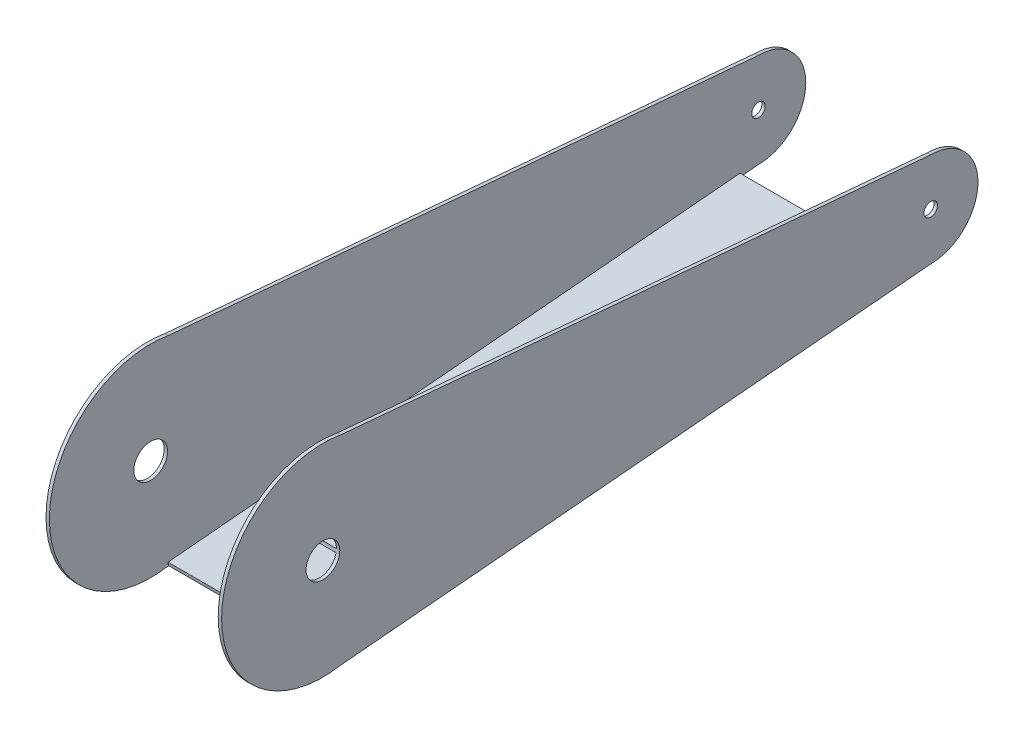
ISO-10303-21;
HEADER;
FILE_DESCRIPTION(('STEP AP214'),'2;1');
FILE_NAME('part.step','',(''),(''),'','','');
FILE_SCHEMA(('AUTOMOTIVE_DESIGN { 1 0 10303 214 1 1 1 1 }'));
ENDSEC;
DATA;
#1=APPLICATION_CONTEXT('core data for automotive mechanical design processes');
#2=APPLICATION_PROTOCOL_DEFINITION('international standard','automotive_design',2000,#1);
#3=PRODUCT_CONTEXT('',#1,'mechanical');
#4=PRODUCT('Part','Part','',(#3));
#5=PRODUCT_RELATED_PRODUCT_CATEGORY('part','',(#4));
#6=PRODUCT_DEFINITION_FORMATION('','',#4);
#7=PRODUCT_DEFINITION_CONTEXT('part definition',#1,'design');
#8=PRODUCT_DEFINITION('design','',#6,#7);
#9=PRODUCT_DEFINITION_SHAPE('','',#8);
#10=(LENGTH_UNIT() NAMED_UNIT(*) SI_UNIT(.MILLI.,.METRE.));
#11=(NAMED_UNIT(*) PLANE_ANGLE_UNIT() SI_UNIT($,.RADIAN.));
#12=(NAMED_UNIT(*) SI_UNIT($,.STERADIAN.) SOLID_ANGLE_UNIT());
#13=UNCERTAINTY_MEASURE_WITH_UNIT(LENGTH_MEASURE(1.E-05),#10,'distance_accuracy_value','');
#14=(GEOMETRIC_REPRESENTATION_CONTEXT(3) GLOBAL_UNCERTAINTY_ASSIGNED_CONTEXT((#13)) GLOBAL_UNIT_ASSIGNED_CONTEXT((#10,
#11,#12)) REPRESENTATION_CONTEXT('',''));
#15=CARTESIAN_POINT('',(0.,0.,0.));
#16=DIRECTION('',(0.,0.,1.));
#17=DIRECTION('',(1.,0.,0.));
#18=AXIS2_PLACEMENT_3D('',#15,#16,#17);
#19=CARTESIAN_POINT('',(25.,0.,-180.));
#20=DIRECTION('',(1.,0.,0.));
#21=DIRECTION('',(0.,0.,-1.));
#22=AXIS2_PLACEMENT_3D('',#19,#20,#21);
#23=PLANE('',#22);
#24=CARTESIAN_POINT('',(25.,0.,-180.));
#25=DIRECTION('',(1.,0.,0.));
#26=DIRECTION('',(0.,0.,-1.));
#27=AXIS2_PLACEMENT_3D('',#24,#25,#26);
#28=CIRCLE('',#27,14.);
#29=CARTESIAN_POINT('',(25.,-14.,-180.));
#30=VERTEX_POINT('',#29);
#31=CARTESIAN_POINT('',(25.,14.,-180.));
#32=VERTEX_POINT('',#31);
#33=EDGE_CURVE('E202',#30,#32,#28,.T.);
#34=ORIENTED_EDGE('',*,*,#33,.F.);
#35=DIRECTION('',(0.,0.0885397902837943,-0.996072640692686));
#36=VECTOR('',#35,1.);
#37=CARTESIAN_POINT('',(25.,-14.,-180.));
#38=LINE('',#37,#36);
#39=CARTESIAN_POINT('',(25.,-14.4804390485647,-174.595060703647));
#40=VERTEX_POINT('',#39);
#41=EDGE_CURVE('E207',#40,#30,#38,.T.);
#42=ORIENTED_EDGE('',*,*,#41,.F.);
#43=DIRECTION('',(0.,-0.996072640692685,-0.0885397902838064));
#44=VECTOR('',#43,1.);
#45=CARTESIAN_POINT('',(25.,-14.4804390485647,-174.595060703647));
#46=LINE('',#45,#44);
#47=CARTESIAN_POINT('',(25.,-13.4843664078711,-174.506520913363));
#48=VERTEX_POINT('',#47);
#49=EDGE_CURVE('E246',#48,#40,#46,.T.);
#50=ORIENTED_EDGE('',*,*,#49,.F.);
#51=DIRECTION('',(0.,0.0885397902838023,-0.996072640692686));
#52=VECTOR('',#51,1.);
#53=CARTESIAN_POINT('',(25.,-13.4843664078711,-174.506520913363));
#54=LINE('',#53,#52);
#55=CARTESIAN_POINT('',(25.,-28.5414398950786,-5.11444418229384));
#56=VERTEX_POINT('',#55);
#57=EDGE_CURVE('E242',#56,#48,#54,.T.);
#58=ORIENTED_EDGE('',*,*,#57,.F.);
#59=DIRECTION('',(0.,0.984321411073003,0.176384125428712));
#60=VECTOR('',#59,1.);
#61=CARTESIAN_POINT('',(25.,-29.5296423321901,-5.29152376286136));
#62=LINE('',#61,#60);
#63=CARTESIAN_POINT('',(25.,-29.5296423321901,-5.29152376286136));
#64=VERTEX_POINT('',#63);
#65=EDGE_CURVE('E238',#64,#56,#62,.T.);
#66=ORIENTED_EDGE('',*,*,#65,.F.);
#67=CARTESIAN_POINT('',(25.,0.,0.));
#68=DIRECTION('',(1.,0.,0.));
#69=DIRECTION('',(0.,0.,-1.));
#70=AXIS2_PLACEMENT_3D('',#67,#68,#69);
#71=CIRCLE('',#70,30.);
#72=CARTESIAN_POINT('',(25.,29.5296423321901,-5.29152376286135));
#73=VERTEX_POINT('',#72);
#74=EDGE_CURVE('E71',#73,#64,#71,.T.);
#75=ORIENTED_EDGE('',*,*,#74,.F.);
#76=DIRECTION('',(0.,0.0885397902837943,0.996072640692686));
#77=VECTOR('',#76,1.);
#78=CARTESIAN_POINT('',(25.,29.5296423321901,-5.29152376286136));
#79=LINE('',#78,#77);
#80=EDGE_CURVE('E233',#32,#73,#79,.T.);
#81=ORIENTED_EDGE('',*,*,#80,.F.);
#82=EDGE_LOOP('',(#34,#42,#50,#58,#66,#75,#81));
#83=FACE_BOUND('',#82,.T.);
#84=DIRECTION('',(0.,0.,1.));
#85=VECTOR('',#84,1.);
#86=CARTESIAN_POINT('',(25.,-1.,0.));
#87=LINE('',#86,#85);
#88=CARTESIAN_POINT('',(25.,-1.,-178.267949192431));
#89=VERTEX_POINT('',#88);
#90=CARTESIAN_POINT('',(25.,-1.,-4.89897948556636));
#91=VERTEX_POINT('',#90);
#92=EDGE_CURVE('E634',#89,#91,#87,.T.);
#93=ORIENTED_EDGE('',*,*,#92,.F.);
#94=CARTESIAN_POINT('',(25.,0.,-180.));
#95=DIRECTION('',(1.,0.,0.));
#96=DIRECTION('',(0.,0.,-1.));
#97=AXIS2_PLACEMENT_3D('',#94,#95,#96);
#98=CIRCLE('',#97,2.);
#99=CARTESIAN_POINT('',(25.,0.,-178.));
#100=VERTEX_POINT('',#99);
#101=EDGE_CURVE('E180',#100,#89,#98,.F.);
#102=ORIENTED_EDGE('',*,*,#101,.F.);
#103=DIRECTION('',(0.,0.,-1.));
#104=VECTOR('',#103,1.);
#105=CARTESIAN_POINT('',(25.,0.,0.));
#106=LINE('',#105,#104);
#107=CARTESIAN_POINT('',(25.,0.,-5.));
#108=VERTEX_POINT('',#107);
#109=EDGE_CURVE('E175',#108,#100,#106,.T.);
#110=ORIENTED_EDGE('',*,*,#109,.F.);
#111=CARTESIAN_POINT('',(25.,0.,0.));
#112=DIRECTION('',(1.,0.,0.));
#113=DIRECTION('',(0.,0.,-1.));
#114=AXIS2_PLACEMENT_3D('',#111,#112,#113);
#115=CIRCLE('',#114,5.);
#116=EDGE_CURVE('E256',#108,#91,#115,.T.);
#117=ORIENTED_EDGE('',*,*,#116,.T.);
#118=EDGE_LOOP('',(#93,#102,#110,#117));
#119=FACE_BOUND('',#118,.T.);
#120=ADVANCED_FACE('F47',(#83,#119),#23,.F.);
#121=CARTESIAN_POINT('',(26.,0.,0.));
#122=DIRECTION('',(-1.,0.,0.));
#123=DIRECTION('',(0.,0.,1.));
#124=AXIS2_PLACEMENT_3D('',#121,#122,#123);
#125=CYLINDRICAL_SURFACE('',#124,30.);
#126=CARTESIAN_POINT('',(-25.,0.,0.));
#127=DIRECTION('',(1.,0.,0.));
#128=DIRECTION('',(0.,0.,-1.));
#129=AXIS2_PLACEMENT_3D('',#126,#127,#128);
#130=CIRCLE('',#129,30.);
#131=CARTESIAN_POINT('',(-25.,29.5296423321901,-5.29152376286136));
#132=VERTEX_POINT('',#131);
#133=CARTESIAN_POINT('',(-25.,-29.5296423321901,-5.29152376286136));
#134=VERTEX_POINT('',#133);
#135=EDGE_CURVE('E210',#132,#134,#130,.T.);
#136=ORIENTED_EDGE('',*,*,#135,.F.);
#137=DIRECTION('',(-1.,0.,0.));
#138=VECTOR('',#137,1.);
#139=CARTESIAN_POINT('',(26.,29.5296423321901,-5.29152376286135));
#140=LINE('',#139,#138);
#141=CARTESIAN_POINT('',(-26.,29.5296423321901,-5.29152376286135));
#142=VERTEX_POINT('',#141);
#143=EDGE_CURVE('E295',#132,#142,#140,.T.);
#144=ORIENTED_EDGE('',*,*,#143,.T.);
#145=CARTESIAN_POINT('',(-26.,0.,0.));
#146=DIRECTION('',(1.,0.,0.));
#147=DIRECTION('',(0.,0.,-1.));
#148=AXIS2_PLACEMENT_3D('',#145,#146,#147);
#149=CIRCLE('',#148,30.);
#150=CARTESIAN_POINT('',(-26.,-29.5296423321901,-5.29152376286135));
#151=VERTEX_POINT('',#150);
#152=EDGE_CURVE('E277',#142,#151,#149,.T.);
#153=ORIENTED_EDGE('',*,*,#152,.T.);
#154=DIRECTION('',(-1.,0.,0.));
#155=VECTOR('',#154,1.);
#156=CARTESIAN_POINT('',(26.,-29.5296423321901,-5.29152376286135));
#157=LINE('',#156,#155);
#158=EDGE_CURVE('E56',#134,#151,#157,.T.);
#159=ORIENTED_EDGE('',*,*,#158,.F.);
#160=EDGE_LOOP('',(#136,#144,#153,#159));
#161=FACE_BOUND('',#160,.T.);
#162=ADVANCED_FACE('F390',(#161),#125,.T.);
#163=CARTESIAN_POINT('',(26.,-14.,-180.));
#164=DIRECTION('',(0.,0.996072640692687,0.0885397902837944));
#165=DIRECTION('',(0.,-0.0885397902837944,0.996072640692687));
#166=AXIS2_PLACEMENT_3D('',#163,#164,#165);
#167=PLANE('',#166);
#168=DIRECTION('',(0.,0.0885397902837943,-0.996072640692686));
#169=VECTOR('',#168,1.);
#170=CARTESIAN_POINT('',(-25.,-14.,-180.));
#171=LINE('',#170,#169);
#172=CARTESIAN_POINT('',(-25.,-14.4804390485647,-174.595060703647));
#173=VERTEX_POINT('',#172);
#174=CARTESIAN_POINT('',(-25.,-14.,-180.));
#175=VERTEX_POINT('',#174);
#176=EDGE_CURVE('E226',#173,#175,#171,.T.);
#177=ORIENTED_EDGE('',*,*,#176,.F.);
#178=DIRECTION('',(1.,0.,0.));
#179=VECTOR('',#178,1.);
#180=CARTESIAN_POINT('',(-25.,-14.4804390485647,-174.595060703647));
#181=LINE('',#180,#179);
#182=EDGE_CURVE('E252',#173,#40,#181,.T.);
#183=ORIENTED_EDGE('',*,*,#182,.T.);
#184=ORIENTED_EDGE('',*,*,#41,.T.);
#185=DIRECTION('',(-1.,0.,0.));
#186=VECTOR('',#185,1.);
#187=CARTESIAN_POINT('',(26.,-14.,-180.));
#188=LINE('',#187,#186);
#189=CARTESIAN_POINT('',(26.,-14.,-180.));
#190=VERTEX_POINT('',#189);
#191=EDGE_CURVE('E319',#190,#30,#188,.T.);
#192=ORIENTED_EDGE('',*,*,#191,.F.);
#193=DIRECTION('',(0.,0.0885397902837943,-0.996072640692686));
#194=VECTOR('',#193,1.);
#195=CARTESIAN_POINT('',(26.,-14.,-180.));
#196=LINE('',#195,#194);
#197=CARTESIAN_POINT('',(26.,-29.5296423321901,-5.29152376286135));
#198=VERTEX_POINT('',#197);
#199=EDGE_CURVE('E285',#198,#190,#196,.T.);
#200=ORIENTED_EDGE('',*,*,#199,.F.);
#201=EDGE_CURVE('E11',#198,#64,#157,.T.);
#202=ORIENTED_EDGE('',*,*,#201,.T.);
#203=DIRECTION('',(1.,0.,0.));
#204=VECTOR('',#203,1.);
#205=CARTESIAN_POINT('',(-25.,-29.5296423321901,-5.29152376286136));
#206=LINE('',#205,#204);
#207=EDGE_CURVE('E229',#134,#64,#206,.T.);
#208=ORIENTED_EDGE('',*,*,#207,.F.);
#209=ORIENTED_EDGE('',*,*,#158,.T.);
#210=DIRECTION('',(0.,0.0885397902837943,-0.996072640692686));
#211=VECTOR('',#210,1.);
#212=CARTESIAN_POINT('',(-26.,-14.,-180.));
#213=LINE('',#212,#211);
#214=CARTESIAN_POINT('',(-26.,-14.,-180.));
#215=VERTEX_POINT('',#214);
#216=EDGE_CURVE('E299',#151,#215,#213,.T.);
#217=ORIENTED_EDGE('',*,*,#216,.T.);
#218=EDGE_CURVE('E318',#175,#215,#188,.T.);
#219=ORIENTED_EDGE('',*,*,#218,.F.);
#220=EDGE_LOOP('',(#177,#183,#184,#192,#200,#202,#208,#209,#217,#219));
#221=FACE_BOUND('',#220,.T.);
#222=ADVANCED_FACE('F339',(#221),#167,.F.);
#223=CARTESIAN_POINT('',(26.,0.,-180.));
#224=DIRECTION('',(-1.,0.,0.));
#225=DIRECTION('',(0.,0.,1.));
#226=AXIS2_PLACEMENT_3D('',#223,#224,#225);
#227=CYLINDRICAL_SURFACE('',#226,14.);
#228=CARTESIAN_POINT('',(-25.,0.,-180.));
#229=DIRECTION('',(1.,0.,0.));
#230=DIRECTION('',(0.,0.,-1.));
#231=AXIS2_PLACEMENT_3D('',#228,#229,#230);
#232=CIRCLE('',#231,14.);
#233=CARTESIAN_POINT('',(-25.,14.,-180.));
#234=VERTEX_POINT('',#233);
#235=EDGE_CURVE('E203',#175,#234,#232,.T.);
#236=ORIENTED_EDGE('',*,*,#235,.F.);
#237=ORIENTED_EDGE('',*,*,#218,.T.);
#238=CARTESIAN_POINT('',(-26.,0.,-180.));
#239=DIRECTION('',(1.,0.,0.));
#240=DIRECTION('',(0.,0.,-1.));
#241=AXIS2_PLACEMENT_3D('',#238,#239,#240);
#242=CIRCLE('',#241,14.);
#243=CARTESIAN_POINT('',(-26.,14.,-180.));
#244=VERTEX_POINT('',#243);
#245=EDGE_CURVE('E303',#215,#244,#242,.T.);
#246=ORIENTED_EDGE('',*,*,#245,.T.);
#247=DIRECTION('',(-1.,0.,0.));
#248=VECTOR('',#247,1.);
#249=CARTESIAN_POINT('',(26.,14.,-180.));
#250=LINE('',#249,#248);
#251=EDGE_CURVE('E314',#234,#244,#250,.T.);
#252=ORIENTED_EDGE('',*,*,#251,.F.);
#253=EDGE_LOOP('',(#236,#237,#246,#252));
#254=FACE_BOUND('',#253,.T.);
#255=ADVANCED_FACE('F332',(#254),#227,.T.);
#256=CARTESIAN_POINT('',(26.,29.5296423321901,-5.29152376286135));
#257=DIRECTION('',(0.,-0.996072640692687,0.0885397902837944));
#258=DIRECTION('',(0.,-0.0885397902837944,-0.996072640692687));
#259=AXIS2_PLACEMENT_3D('',#256,#257,#258);
#260=PLANE('',#259);
#261=DIRECTION('',(0.,0.0885397902837943,0.996072640692686));
#262=VECTOR('',#261,1.);
#263=CARTESIAN_POINT('',(-25.,29.5296423321901,-5.29152376286136));
#264=LINE('',#263,#262);
#265=EDGE_CURVE('E206',#234,#132,#264,.T.);
#266=ORIENTED_EDGE('',*,*,#265,.F.);
#267=ORIENTED_EDGE('',*,*,#251,.T.);
#268=DIRECTION('',(0.,0.0885397902837943,0.996072640692686));
#269=VECTOR('',#268,1.);
#270=CARTESIAN_POINT('',(-26.,29.5296423321901,-5.29152376286135));
#271=LINE('',#270,#269);
#272=EDGE_CURVE('E286',#244,#142,#271,.T.);
#273=ORIENTED_EDGE('',*,*,#272,.T.);
#274=ORIENTED_EDGE('',*,*,#143,.F.);
#275=EDGE_LOOP('',(#266,#267,#273,#274));
#276=FACE_BOUND('',#275,.T.);
#277=ADVANCED_FACE('F349',(#276),#260,.F.);
#278=CARTESIAN_POINT('',(26.,0.,0.));
#279=DIRECTION('',(-1.,0.,0.));
#280=DIRECTION('',(0.,0.,1.));
#281=AXIS2_PLACEMENT_3D('',#278,#279,#280);
#282=CYLINDRICAL_SURFACE('',#281,5.);
#283=CARTESIAN_POINT('',(-26.,0.,0.));
#284=DIRECTION('',(1.,0.,0.));
#285=DIRECTION('',(0.,0.,-1.));
#286=AXIS2_PLACEMENT_3D('',#283,#284,#285);
#287=CIRCLE('',#286,5.);
#288=CARTESIAN_POINT('',(-26.,0.,5.));
#289=VERTEX_POINT('',#288);
#290=EDGE_CURVE('E272',#289,#289,#287,.T.);
#291=CARTESIAN_POINT('',(-25.,0.,0.));
#292=DIRECTION('',(1.,0.,0.));
#293=DIRECTION('',(0.,0.,-1.));
#294=AXIS2_PLACEMENT_3D('',#291,#292,#293);
#295=CIRCLE('',#294,5.);
#296=CARTESIAN_POINT('',(-25.,0.,5.));
#297=VERTEX_POINT('',#296);
#298=EDGE_CURVE('E268',#297,#297,#295,.T.);
#299=CARTESIAN_POINT('',(-26.,0.,5.));
#300=CARTESIAN_POINT('',(-25.9895833333333,0.,5.));
#301=CARTESIAN_POINT('',(-25.9791666666667,0.,5.));
#302=CARTESIAN_POINT('',(-25.9583333333333,0.,5.));
#303=CARTESIAN_POINT('',(-25.9479166666667,0.,5.));
#304=CARTESIAN_POINT('',(-25.9270833333333,0.,5.));
#305=CARTESIAN_POINT('',(-25.9166666666667,0.,5.));
#306=CARTESIAN_POINT('',(-25.8958333333333,0.,5.));
#307=CARTESIAN_POINT('',(-25.8854166666667,0.,5.));
#308=CARTESIAN_POINT('',(-25.8645833333333,0.,5.));
#309=CARTESIAN_POINT('',(-25.8541666666667,0.,5.));
#310=CARTESIAN_POINT('',(-25.8333333333333,0.,5.));
#311=CARTESIAN_POINT('',(-25.8229166666667,0.,5.));
#312=CARTESIAN_POINT('',(-25.8020833333333,0.,5.));
#313=CARTESIAN_POINT('',(-25.7916666666667,0.,5.));
#314=CARTESIAN_POINT('',(-25.7708333333333,0.,5.));
#315=CARTESIAN_POINT('',(-25.7604166666667,0.,5.));
#316=CARTESIAN_POINT('',(-25.7395833333333,0.,5.));
#317=CARTESIAN_POINT('',(-25.7291666666667,0.,5.));
#318=CARTESIAN_POINT('',(-25.7083333333333,0.,5.));
#319=CARTESIAN_POINT('',(-25.6979166666667,0.,5.));
#320=CARTESIAN_POINT('',(-25.6770833333333,0.,5.));
#321=CARTESIAN_POINT('',(-25.6666666666667,0.,5.));
#322=CARTESIAN_POINT('',(-25.6458333333333,0.,5.));
#323=CARTESIAN_POINT('',(-25.6354166666667,0.,5.));
#324=CARTESIAN_POINT('',(-25.6145833333333,0.,5.));
#325=CARTESIAN_POINT('',(-25.6041666666667,0.,5.));
#326=CARTESIAN_POINT('',(-25.5833333333333,0.,5.));
#327=CARTESIAN_POINT('',(-25.5729166666667,0.,5.));
#328=CARTESIAN_POINT('',(-25.5520833333333,0.,5.));
#329=CARTESIAN_POINT('',(-25.5416666666667,0.,5.));
#330=CARTESIAN_POINT('',(-25.5208333333333,0.,5.));
#331=CARTESIAN_POINT('',(-25.5104166666667,0.,5.));
#332=CARTESIAN_POINT('',(-25.4895833333333,0.,5.));
#333=CARTESIAN_POINT('',(-25.4791666666667,0.,5.));
#334=CARTESIAN_POINT('',(-25.4583333333333,0.,5.));
#335=CARTESIAN_POINT('',(-25.4479166666667,0.,5.));
#336=CARTESIAN_POINT('',(-25.4270833333333,0.,5.));
#337=CARTESIAN_POINT('',(-25.4166666666667,0.,5.));
#338=CARTESIAN_POINT('',(-25.3958333333333,0.,5.));
#339=CARTESIAN_POINT('',(-25.3854166666667,0.,5.));
#340=CARTESIAN_POINT('',(-25.3645833333333,0.,5.));
#341=CARTESIAN_POINT('',(-25.3541666666667,0.,5.));
#342=CARTESIAN_POINT('',(-25.3333333333333,0.,5.));
#343=CARTESIAN_POINT('',(-25.3229166666667,0.,5.));
#344=CARTESIAN_POINT('',(-25.3020833333333,0.,5.));
#345=CARTESIAN_POINT('',(-25.2916666666667,0.,5.));
#346=CARTESIAN_POINT('',(-25.2708333333333,0.,5.));
#347=CARTESIAN_POINT('',(-25.2604166666667,0.,5.));
#348=CARTESIAN_POINT('',(-25.2395833333333,0.,5.));
#349=CARTESIAN_POINT('',(-25.2291666666667,0.,5.));
#350=CARTESIAN_POINT('',(-25.2083333333333,0.,5.));
#351=CARTESIAN_POINT('',(-25.1979166666667,0.,5.));
#352=CARTESIAN_POINT('',(-25.1770833333333,0.,5.));
#353=CARTESIAN_POINT('',(-25.1666666666667,0.,5.));
#354=CARTESIAN_POINT('',(-25.1458333333333,0.,5.));
#355=CARTESIAN_POINT('',(-25.1354166666667,0.,5.));
#356=CARTESIAN_POINT('',(-25.1145833333333,0.,5.));
#357=CARTESIAN_POINT('',(-25.1041666666667,0.,5.));
#358=CARTESIAN_POINT('',(-25.0833333333333,0.,5.));
#359=CARTESIAN_POINT('',(-25.0729166666667,0.,5.));
#360=CARTESIAN_POINT('',(-25.0520833333333,0.,5.));
#361=CARTESIAN_POINT('',(-25.0416666666667,0.,5.));
#362=CARTESIAN_POINT('',(-25.0208333333333,0.,5.));
#363=CARTESIAN_POINT('',(-25.0104166666667,0.,5.));
#364=CARTESIAN_POINT('',(-25.,0.,5.));
#365=B_SPLINE_CURVE_WITH_KNOTS('',3,(#299,#300,#301,#302,#303,#304,#305,#306,#307,#308,#309,
#310,#311,#312,#313,#314,#315,#316,#317,#318,#319,#320,#321,#322,#323,#324,#325,#326,#327,#328,
#329,#330,#331,#332,#333,#334,#335,#336,#337,#338,#339,#340,#341,#342,#343,#344,#345,#346,#347,
#348,#349,#350,#351,#352,#353,#354,#355,#356,#357,#358,#359,#360,#361,#362,#363,#364),
.UNSPECIFIED.,.F.,.F.,(4,2,2,2,2,2,2,2,2,2,2,2,2,2,2,2,2,2,2,2,2,2,2,2,2,2,2,2,2,2,2,2,4),(0.,
0.0312499999999966,0.0625000000000001,0.0937499999999966,0.125,0.156249999999997,0.1875,
0.218749999999997,0.25,0.281249999999997,0.312499999999993,0.343749999999997,0.374999999999993,
0.406249999999997,0.437499999999993,0.468749999999997,0.499999999999994,0.53124999999999,
0.562499999999994,0.59374999999999,0.624999999999994,0.65624999999999,0.687499999999994,
0.71874999999999,0.749999999999987,0.78124999999999,0.812499999999987,0.84374999999999,
0.874999999999987,0.90624999999999,0.937499999999987,0.96874999999999,0.999999999999987),.UNSPECIFIED.);
#366=EDGE_CURVE('BSEAM445',#289,#297,#365,.T.);
#367=ORIENTED_EDGE('',*,*,#290,.F.);
#368=ORIENTED_EDGE('',*,*,#298,.T.);
#369=ORIENTED_EDGE('',*,*,#366,.T.);
#370=ORIENTED_EDGE('',*,*,#366,.F.);
#371=EDGE_LOOP('',(#367,#369,#368,#370));
#372=FACE_BOUND('',#371,.T.);
#373=ADVANCED_FACE('F445',(#372),#282,.F.);
#374=CARTESIAN_POINT('',(26.,0.,0.));
#375=DIRECTION('',(1.,0.,0.));
#376=DIRECTION('',(0.,0.,-1.));
#377=AXIS2_PLACEMENT_3D('',#374,#375,#376);
#378=PLANE('',#377);
#379=CARTESIAN_POINT('',(26.,0.,0.));
#380=DIRECTION('',(1.,0.,0.));
#381=DIRECTION('',(0.,0.,-1.));
#382=AXIS2_PLACEMENT_3D('',#379,#380,#381);
#383=CIRCLE('',#382,5.);
#384=CARTESIAN_POINT('',(26.,0.,-5.));
#385=VERTEX_POINT('',#384);
#386=EDGE_CURVE('E273',#385,#385,#383,.T.);
#387=ORIENTED_EDGE('',*,*,#386,.F.);
#388=EDGE_LOOP('',(#387));
#389=FACE_BOUND('',#388,.T.);
#390=CARTESIAN_POINT('',(26.,0.,0.));
#391=DIRECTION('',(1.,0.,0.));
#392=DIRECTION('',(0.,0.,-1.));
#393=AXIS2_PLACEMENT_3D('',#390,#391,#392);
#394=CIRCLE('',#393,30.);
#395=CARTESIAN_POINT('',(26.,29.5296423321901,-5.29152376286135));
#396=VERTEX_POINT('',#395);
#397=EDGE_CURVE('E281',#396,#198,#394,.T.);
#398=ORIENTED_EDGE('',*,*,#397,.T.);
#399=ORIENTED_EDGE('',*,*,#199,.T.);
#400=CARTESIAN_POINT('',(26.,0.,-180.));
#401=DIRECTION('',(1.,0.,0.));
#402=DIRECTION('',(0.,0.,-1.));
#403=AXIS2_PLACEMENT_3D('',#400,#401,#402);
#404=CIRCLE('',#403,14.);
#405=CARTESIAN_POINT('',(26.,14.,-180.));
#406=VERTEX_POINT('',#405);
#407=EDGE_CURVE('E289',#190,#406,#404,.T.);
#408=ORIENTED_EDGE('',*,*,#407,.T.);
#409=DIRECTION('',(0.,0.0885397902837943,0.996072640692686));
#410=VECTOR('',#409,1.);
#411=CARTESIAN_POINT('',(26.,29.5296423321901,-5.29152376286135));
#412=LINE('',#411,#410);
#413=EDGE_CURVE('E292',#406,#396,#412,.T.);
#414=ORIENTED_EDGE('',*,*,#413,.T.);
#415=EDGE_LOOP('',(#398,#399,#408,#414));
#416=FACE_BOUND('',#415,.T.);
#417=CARTESIAN_POINT('',(26.,0.,-180.));
#418=DIRECTION('',(1.,0.,0.));
#419=DIRECTION('',(0.,0.,-1.));
#420=AXIS2_PLACEMENT_3D('',#417,#418,#419);
#421=CIRCLE('',#420,2.);
#422=CARTESIAN_POINT('',(26.,0.,-182.));
#423=VERTEX_POINT('',#422);
#424=EDGE_CURVE('E182',#423,#423,#421,.T.);
#425=ORIENTED_EDGE('',*,*,#424,.F.);
#426=EDGE_LOOP('',(#425));
#427=FACE_BOUND('',#426,.T.);
#428=ADVANCED_FACE('F409',(#389,#416,#427),#378,.T.);
#429=CARTESIAN_POINT('',(-26.,0.,0.));
#430=DIRECTION('',(1.,0.,0.));
#431=DIRECTION('',(0.,0.,-1.));
#432=AXIS2_PLACEMENT_3D('',#429,#430,#431);
#433=PLANE('',#432);
#434=ORIENTED_EDGE('',*,*,#152,.F.);
#435=ORIENTED_EDGE('',*,*,#272,.F.);
#436=ORIENTED_EDGE('',*,*,#245,.F.);
#437=ORIENTED_EDGE('',*,*,#216,.F.);
#438=EDGE_LOOP('',(#434,#435,#436,#437));
#439=FACE_BOUND('',#438,.T.);
#440=ORIENTED_EDGE('',*,*,#290,.T.);
#441=EDGE_LOOP('',(#440));
#442=FACE_BOUND('',#441,.T.);
#443=CARTESIAN_POINT('',(-26.,0.,-180.));
#444=DIRECTION('',(-1.,0.,0.));
#445=DIRECTION('',(0.,0.,1.));
#446=AXIS2_PLACEMENT_3D('',#443,#444,#445);
#447=CIRCLE('',#446,2.);
#448=CARTESIAN_POINT('',(-26.,0.,-178.));
#449=VERTEX_POINT('',#448);
#450=EDGE_CURVE('E194',#449,#449,#447,.T.);
#451=ORIENTED_EDGE('',*,*,#450,.F.);
#452=EDGE_LOOP('',(#451));
#453=FACE_BOUND('',#452,.T.);
#454=ADVANCED_FACE('F344',(#439,#442,#453),#433,.F.);
#455=EDGE_CURVE('E310',#396,#73,#140,.T.);
#456=ORIENTED_EDGE('',*,*,#455,.T.);
#457=ORIENTED_EDGE('',*,*,#74,.T.);
#458=ORIENTED_EDGE('',*,*,#201,.F.);
#459=ORIENTED_EDGE('',*,*,#397,.F.);
#460=EDGE_LOOP('',(#456,#457,#458,#459));
#461=FACE_BOUND('',#460,.T.);
#462=ADVANCED_FACE('F49',(#461),#125,.T.);
#463=ORIENTED_EDGE('',*,*,#191,.T.);
#464=ORIENTED_EDGE('',*,*,#33,.T.);
#465=EDGE_CURVE('E315',#406,#32,#250,.T.);
#466=ORIENTED_EDGE('',*,*,#465,.F.);
#467=ORIENTED_EDGE('',*,*,#407,.F.);
#468=EDGE_LOOP('',(#463,#464,#466,#467));
#469=FACE_BOUND('',#468,.T.);
#470=ADVANCED_FACE('F402',(#469),#227,.T.);
#471=ORIENTED_EDGE('',*,*,#465,.T.);
#472=ORIENTED_EDGE('',*,*,#80,.T.);
#473=ORIENTED_EDGE('',*,*,#455,.F.);
#474=ORIENTED_EDGE('',*,*,#413,.F.);
#475=EDGE_LOOP('',(#471,#472,#473,#474));
#476=FACE_BOUND('',#475,.T.);
#477=ADVANCED_FACE('F405',(#476),#260,.F.);
#478=ORIENTED_EDGE('',*,*,#116,.F.);
#479=DIRECTION('',(1.,0.,0.));
#480=VECTOR('',#479,1.);
#481=CARTESIAN_POINT('',(20.,0.,-5.));
#482=LINE('',#481,#480);
#483=CARTESIAN_POINT('',(20.,0.,-5.));
#484=VERTEX_POINT('',#483);
#485=EDGE_CURVE('E188',#484,#108,#482,.T.);
#486=ORIENTED_EDGE('',*,*,#485,.F.);
#487=CARTESIAN_POINT('',(20.,0.,0.));
#488=DIRECTION('',(-1.,0.,0.));
#489=DIRECTION('',(0.,0.,1.));
#490=AXIS2_PLACEMENT_3D('',#487,#488,#489);
#491=CIRCLE('',#490,5.);
#492=CARTESIAN_POINT('',(20.,-1.,-4.89897948556636));
#493=VERTEX_POINT('',#492);
#494=EDGE_CURVE('E168',#493,#484,#491,.F.);
#495=ORIENTED_EDGE('',*,*,#494,.F.);
#496=DIRECTION('',(1.,0.,0.));
#497=VECTOR('',#496,1.);
#498=CARTESIAN_POINT('',(20.,-1.,-4.89897948556636));
#499=LINE('',#498,#497);
#500=EDGE_CURVE('E164',#493,#91,#499,.T.);
#501=ORIENTED_EDGE('',*,*,#500,.T.);
#502=EDGE_LOOP('',(#478,#486,#495,#501));
#503=FACE_BOUND('',#502,.T.);
#504=ORIENTED_EDGE('',*,*,#386,.T.);
#505=EDGE_LOOP('',(#504));
#506=FACE_BOUND('',#505,.T.);
#507=ADVANCED_FACE('F434',(#503,#506),#282,.F.);
#508=CARTESIAN_POINT('',(-25.,-14.4804390485647,-174.595060703647));
#509=DIRECTION('',(0.,-0.0885397902838064,0.996072640692686));
#510=DIRECTION('',(0.,-0.996072640692686,-0.0885397902838064));
#511=AXIS2_PLACEMENT_3D('',#508,#509,#510);
#512=PLANE('',#511);
#513=ORIENTED_EDGE('',*,*,#49,.T.);
#514=ORIENTED_EDGE('',*,*,#182,.F.);
#515=DIRECTION('',(0.,-0.996072640692685,-0.0885397902838064));
#516=VECTOR('',#515,1.);
#517=CARTESIAN_POINT('',(-25.,-14.4804390485647,-174.595060703647));
#518=LINE('',#517,#516);
#519=CARTESIAN_POINT('',(-25.,-13.4843664078711,-174.506520913363));
#520=VERTEX_POINT('',#519);
#521=EDGE_CURVE('E222',#520,#173,#518,.T.);
#522=ORIENTED_EDGE('',*,*,#521,.F.);
#523=DIRECTION('',(1.,0.,0.));
#524=VECTOR('',#523,1.);
#525=CARTESIAN_POINT('',(-25.,-13.4843664078711,-174.506520913363));
#526=LINE('',#525,#524);
#527=EDGE_CURVE('E257',#520,#48,#526,.T.);
#528=ORIENTED_EDGE('',*,*,#527,.T.);
#529=EDGE_LOOP('',(#513,#514,#522,#528));
#530=FACE_BOUND('',#529,.T.);
#531=ADVANCED_FACE('F397',(#530),#512,.F.);
#532=CARTESIAN_POINT('',(-25.,-13.4843664078711,-174.506520913363));
#533=DIRECTION('',(0.,-0.996072640692686,-0.0885397902838023));
#534=DIRECTION('',(0.,0.0885397902838023,-0.996072640692686));
#535=AXIS2_PLACEMENT_3D('',#532,#533,#534);
#536=PLANE('',#535);
#537=ORIENTED_EDGE('',*,*,#57,.T.);
#538=ORIENTED_EDGE('',*,*,#527,.F.);
#539=DIRECTION('',(0.,0.0885397902838023,-0.996072640692686));
#540=VECTOR('',#539,1.);
#541=CARTESIAN_POINT('',(-25.,-13.4843664078711,-174.506520913363));
#542=LINE('',#541,#540);
#543=CARTESIAN_POINT('',(-25.,-28.5414398950786,-5.11444418229384));
#544=VERTEX_POINT('',#543);
#545=EDGE_CURVE('E218',#544,#520,#542,.T.);
#546=ORIENTED_EDGE('',*,*,#545,.F.);
#547=DIRECTION('',(1.,0.,0.));
#548=VECTOR('',#547,1.);
#549=CARTESIAN_POINT('',(-25.,-28.5414398950786,-5.11444418229384));
#550=LINE('',#549,#548);
#551=EDGE_CURVE('E260',#544,#56,#550,.T.);
#552=ORIENTED_EDGE('',*,*,#551,.T.);
#553=EDGE_LOOP('',(#537,#538,#546,#552));
#554=FACE_BOUND('',#553,.T.);
#555=ADVANCED_FACE('F433',(#554),#536,.F.);
#556=CARTESIAN_POINT('',(-25.,-29.5296423321901,-5.29152376286136));
#557=DIRECTION('',(0.,0.176384125428712,-0.984321411073003));
#558=DIRECTION('',(0.,0.984321411073003,0.176384125428712));
#559=AXIS2_PLACEMENT_3D('',#556,#557,#558);
#560=PLANE('',#559);
#561=ORIENTED_EDGE('',*,*,#65,.T.);
#562=ORIENTED_EDGE('',*,*,#551,.F.);
#563=DIRECTION('',(0.,0.984321411073003,0.176384125428712));
#564=VECTOR('',#563,1.);
#565=CARTESIAN_POINT('',(-25.,-29.5296423321901,-5.29152376286136));
#566=LINE('',#565,#564);
#567=EDGE_CURVE('E214',#134,#544,#566,.T.);
#568=ORIENTED_EDGE('',*,*,#567,.F.);
#569=ORIENTED_EDGE('',*,*,#207,.T.);
#570=EDGE_LOOP('',(#561,#562,#568,#569));
#571=FACE_BOUND('',#570,.T.);
#572=ADVANCED_FACE('F437',(#571),#560,.F.);
#573=CARTESIAN_POINT('',(-25.,0.,-180.));
#574=DIRECTION('',(1.,0.,0.));
#575=DIRECTION('',(0.,0.,-1.));
#576=AXIS2_PLACEMENT_3D('',#573,#574,#575);
#577=PLANE('',#576);
#578=ORIENTED_EDGE('',*,*,#298,.F.);
#579=EDGE_LOOP('',(#578));
#580=FACE_BOUND('',#579,.T.);
#581=ORIENTED_EDGE('',*,*,#235,.T.);
#582=ORIENTED_EDGE('',*,*,#265,.T.);
#583=ORIENTED_EDGE('',*,*,#135,.T.);
#584=ORIENTED_EDGE('',*,*,#567,.T.);
#585=ORIENTED_EDGE('',*,*,#545,.T.);
#586=ORIENTED_EDGE('',*,*,#521,.T.);
#587=ORIENTED_EDGE('',*,*,#176,.T.);
#588=EDGE_LOOP('',(#581,#582,#583,#584,#585,#586,#587));
#589=FACE_BOUND('',#588,.T.);
#590=CARTESIAN_POINT('',(-25.,0.,-180.));
#591=DIRECTION('',(1.,0.,0.));
#592=DIRECTION('',(0.,0.,-1.));
#593=AXIS2_PLACEMENT_3D('',#590,#591,#592);
#594=CIRCLE('',#593,2.);
#595=CARTESIAN_POINT('',(-25.,0.,-182.));
#596=VERTEX_POINT('',#595);
#597=EDGE_CURVE('E198',#596,#596,#594,.F.);
#598=ORIENTED_EDGE('',*,*,#597,.T.);
#599=EDGE_LOOP('',(#598));
#600=FACE_BOUND('',#599,.T.);
#601=ADVANCED_FACE('F392',(#580,#589,#600),#577,.T.);
#602=CARTESIAN_POINT('',(-17.4348157275902,0.,-180.));
#603=DIRECTION('',(-1.,0.,0.));
#604=DIRECTION('',(0.,0.,1.));
#605=AXIS2_PLACEMENT_3D('',#602,#603,#604);
#606=CYLINDRICAL_SURFACE('',#605,2.);
#607=ORIENTED_EDGE('',*,*,#450,.T.);
#608=EDGE_LOOP('',(#607));
#609=FACE_BOUND('',#608,.T.);
#610=ORIENTED_EDGE('',*,*,#597,.F.);
#611=EDGE_LOOP('',(#610));
#612=FACE_BOUND('',#611,.T.);
#613=ADVANCED_FACE('F467',(#609,#612),#606,.F.);
#614=CARTESIAN_POINT('',(17.9289321881345,0.,-180.));
#615=DIRECTION('',(1.,0.,0.));
#616=DIRECTION('',(0.,0.,-1.));
#617=AXIS2_PLACEMENT_3D('',#614,#615,#616);
#618=CYLINDRICAL_SURFACE('',#617,2.);
#619=ORIENTED_EDGE('',*,*,#101,.T.);
#620=DIRECTION('',(1.,0.,0.));
#621=VECTOR('',#620,1.);
#622=CARTESIAN_POINT('',(20.,-1.,-178.267949192431));
#623=LINE('',#622,#621);
#624=CARTESIAN_POINT('',(20.,-1.,-178.267949192431));
#625=VERTEX_POINT('',#624);
#626=EDGE_CURVE('E161',#625,#89,#623,.T.);
#627=ORIENTED_EDGE('',*,*,#626,.F.);
#628=CARTESIAN_POINT('',(20.,0.,-180.));
#629=DIRECTION('',(-1.,0.,0.));
#630=DIRECTION('',(0.,0.,1.));
#631=AXIS2_PLACEMENT_3D('',#628,#629,#630);
#632=CIRCLE('',#631,2.);
#633=CARTESIAN_POINT('',(20.,0.,-178.));
#634=VERTEX_POINT('',#633);
#635=EDGE_CURVE('E169',#634,#625,#632,.F.);
#636=ORIENTED_EDGE('',*,*,#635,.F.);
#637=DIRECTION('',(1.,0.,0.));
#638=VECTOR('',#637,1.);
#639=CARTESIAN_POINT('',(20.,0.,-178.));
#640=LINE('',#639,#638);
#641=EDGE_CURVE('E63',#634,#100,#640,.T.);
#642=ORIENTED_EDGE('',*,*,#641,.T.);
#643=EDGE_LOOP('',(#619,#627,#636,#642));
#644=FACE_BOUND('',#643,.T.);
#645=ORIENTED_EDGE('',*,*,#424,.T.);
#646=EDGE_LOOP('',(#645));
#647=FACE_BOUND('',#646,.T.);
#648=ADVANCED_FACE('F177',(#644,#647),#618,.F.);
#649=CARTESIAN_POINT('',(20.,-1.,0.));
#650=DIRECTION('',(0.,1.,0.));
#651=DIRECTION('',(0.,0.,1.));
#652=AXIS2_PLACEMENT_3D('',#649,#650,#651);
#653=PLANE('',#652);
#654=ORIENTED_EDGE('',*,*,#92,.T.);
#655=ORIENTED_EDGE('',*,*,#500,.F.);
#656=DIRECTION('',(0.,0.,1.));
#657=VECTOR('',#656,1.);
#658=CARTESIAN_POINT('',(20.,-1.,0.));
#659=LINE('',#658,#657);
#660=EDGE_CURVE('E157',#625,#493,#659,.T.);
#661=ORIENTED_EDGE('',*,*,#660,.F.);
#662=ORIENTED_EDGE('',*,*,#626,.T.);
#663=EDGE_LOOP('',(#654,#655,#661,#662));
#664=FACE_BOUND('',#663,.T.);
#665=ADVANCED_FACE('F159',(#664),#653,.F.);
#666=CARTESIAN_POINT('',(20.,0.,0.));
#667=DIRECTION('',(0.,-1.,0.));
#668=DIRECTION('',(0.,0.,-1.));
#669=AXIS2_PLACEMENT_3D('',#666,#667,#668);
#670=PLANE('',#669);
#671=ORIENTED_EDGE('',*,*,#109,.T.);
#672=ORIENTED_EDGE('',*,*,#641,.F.);
#673=DIRECTION('',(0.,0.,-1.));
#674=VECTOR('',#673,1.);
#675=CARTESIAN_POINT('',(20.,0.,0.));
#676=LINE('',#675,#674);
#677=EDGE_CURVE('E173',#484,#634,#676,.T.);
#678=ORIENTED_EDGE('',*,*,#677,.F.);
#679=ORIENTED_EDGE('',*,*,#485,.T.);
#680=EDGE_LOOP('',(#671,#672,#678,#679));
#681=FACE_BOUND('',#680,.T.);
#682=ADVANCED_FACE('F481',(#681),#670,.F.);
#683=CARTESIAN_POINT('',(20.,0.,0.));
#684=DIRECTION('',(-1.,0.,0.));
#685=DIRECTION('',(0.,0.,1.));
#686=AXIS2_PLACEMENT_3D('',#683,#684,#685);
#687=PLANE('',#686);
#688=ORIENTED_EDGE('',*,*,#635,.T.);
#689=ORIENTED_EDGE('',*,*,#660,.T.);
#690=ORIENTED_EDGE('',*,*,#494,.T.);
#691=ORIENTED_EDGE('',*,*,#677,.T.);
#692=EDGE_LOOP('',(#688,#689,#690,#691));
#693=FACE_BOUND('',#692,.T.);
#694=ADVANCED_FACE('F171',(#693),#687,.T.);
#695=CLOSED_SHELL('',(#120,#162,#222,#255,#277,#373,#428,#454,#462,#470,#477,#507,#531,#555,
#572,#601,#613,#648,#665,#682,#694));
#696=MANIFOLD_SOLID_BREP('B2',#695);
#697=ADVANCED_BREP_SHAPE_REPRESENTATION('',(#18,#696),#14);
#698=SHAPE_DEFINITION_REPRESENTATION(#9,#697);
ENDSEC;
END-ISO-10303-21;
